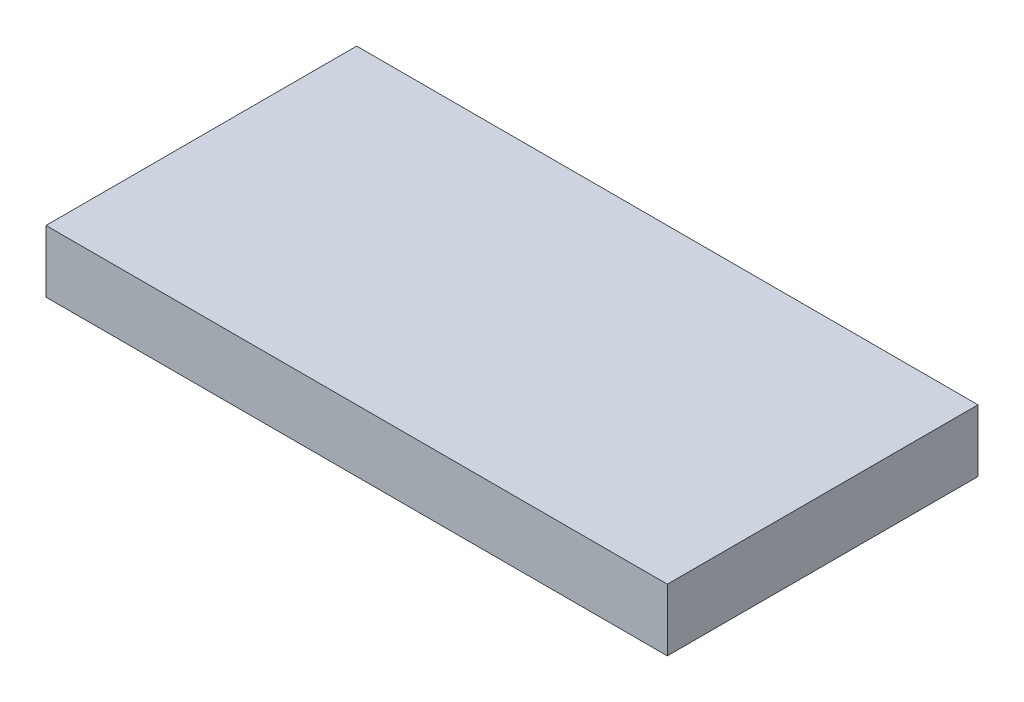
ISO-10303-21;
HEADER;
FILE_DESCRIPTION(('STEP AP214'),'2;1');
FILE_NAME('part.step','',(''),(''),'','','');
FILE_SCHEMA(('AUTOMOTIVE_DESIGN { 1 0 10303 214 1 1 1 1 }'));
ENDSEC;
DATA;
#1=APPLICATION_CONTEXT('core data for automotive mechanical design processes');
#2=APPLICATION_PROTOCOL_DEFINITION('international standard','automotive_design',2000,#1);
#3=PRODUCT_CONTEXT('',#1,'mechanical');
#4=PRODUCT('Part','Part','',(#3));
#5=PRODUCT_RELATED_PRODUCT_CATEGORY('part','',(#4));
#6=PRODUCT_DEFINITION_FORMATION('','',#4);
#7=PRODUCT_DEFINITION_CONTEXT('part definition',#1,'design');
#8=PRODUCT_DEFINITION('design','',#6,#7);
#9=PRODUCT_DEFINITION_SHAPE('','',#8);
#10=(LENGTH_UNIT() NAMED_UNIT(*) SI_UNIT(.MILLI.,.METRE.));
#11=(NAMED_UNIT(*) PLANE_ANGLE_UNIT() SI_UNIT($,.RADIAN.));
#12=(NAMED_UNIT(*) SI_UNIT($,.STERADIAN.) SOLID_ANGLE_UNIT());
#13=UNCERTAINTY_MEASURE_WITH_UNIT(LENGTH_MEASURE(1.E-05),#10,'distance_accuracy_value','');
#14=(GEOMETRIC_REPRESENTATION_CONTEXT(3) GLOBAL_UNCERTAINTY_ASSIGNED_CONTEXT((#13)) GLOBAL_UNIT_ASSIGNED_CONTEXT((#10,
#11,#12)) REPRESENTATION_CONTEXT('',''));
#15=CARTESIAN_POINT('',(0.,0.,0.));
#16=DIRECTION('',(0.,0.,1.));
#17=DIRECTION('',(1.,0.,0.));
#18=AXIS2_PLACEMENT_3D('',#15,#16,#17);
#19=CARTESIAN_POINT('',(0.,1.,0.));
#20=DIRECTION('',(1.,0.,0.));
#21=DIRECTION('',(0.,0.,-1.));
#22=AXIS2_PLACEMENT_3D('',#19,#20,#21);
#23=PLANE('',#22);
#24=DIRECTION('',(0.,0.,1.));
#25=VECTOR('',#24,1.);
#26=CARTESIAN_POINT('',(0.,0.,0.));
#27=LINE('',#26,#25);
#28=CARTESIAN_POINT('',(0.,0.,-5.));
#29=VERTEX_POINT('',#28);
#30=CARTESIAN_POINT('',(0.,0.,0.));
#31=VERTEX_POINT('',#30);
#32=EDGE_CURVE('E100',#29,#31,#27,.T.);
#33=ORIENTED_EDGE('',*,*,#32,.T.);
#34=DIRECTION('',(0.,-1.,0.));
#35=VECTOR('',#34,1.);
#36=CARTESIAN_POINT('',(0.,1.,0.));
#37=LINE('',#36,#35);
#38=CARTESIAN_POINT('',(0.,1.,0.));
#39=VERTEX_POINT('',#38);
#40=EDGE_CURVE('E11',#39,#31,#37,.T.);
#41=ORIENTED_EDGE('',*,*,#40,.F.);
#42=DIRECTION('',(0.,0.,1.));
#43=VECTOR('',#42,1.);
#44=CARTESIAN_POINT('',(0.,1.,0.));
#45=LINE('',#44,#43);
#46=CARTESIAN_POINT('',(0.,1.,-5.));
#47=VERTEX_POINT('',#46);
#48=EDGE_CURVE('E88',#47,#39,#45,.T.);
#49=ORIENTED_EDGE('',*,*,#48,.F.);
#50=DIRECTION('',(0.,-1.,0.));
#51=VECTOR('',#50,1.);
#52=CARTESIAN_POINT('',(0.,1.,-5.));
#53=LINE('',#52,#51);
#54=EDGE_CURVE('E96',#47,#29,#53,.T.);
#55=ORIENTED_EDGE('',*,*,#54,.T.);
#56=EDGE_LOOP('',(#33,#41,#49,#55));
#57=FACE_BOUND('',#56,.T.);
#58=ADVANCED_FACE('F37',(#57),#23,.F.);
#59=CARTESIAN_POINT('',(0.,1.,0.));
#60=DIRECTION('',(0.,0.,-1.));
#61=DIRECTION('',(-1.,0.,0.));
#62=AXIS2_PLACEMENT_3D('',#59,#60,#61);
#63=PLANE('',#62);
#64=DIRECTION('',(1.,0.,0.));
#65=VECTOR('',#64,1.);
#66=CARTESIAN_POINT('',(0.,0.,0.));
#67=LINE('',#66,#65);
#68=CARTESIAN_POINT('',(10.,0.,0.));
#69=VERTEX_POINT('',#68);
#70=EDGE_CURVE('E92',#31,#69,#67,.T.);
#71=ORIENTED_EDGE('',*,*,#70,.T.);
#72=DIRECTION('',(0.,-1.,0.));
#73=VECTOR('',#72,1.);
#74=CARTESIAN_POINT('',(10.,1.,0.));
#75=LINE('',#74,#73);
#76=CARTESIAN_POINT('',(10.,1.,0.));
#77=VERTEX_POINT('',#76);
#78=EDGE_CURVE('E45',#77,#69,#75,.T.);
#79=ORIENTED_EDGE('',*,*,#78,.F.);
#80=DIRECTION('',(1.,0.,0.));
#81=VECTOR('',#80,1.);
#82=CARTESIAN_POINT('',(0.,1.,0.));
#83=LINE('',#82,#81);
#84=EDGE_CURVE('E83',#39,#77,#83,.T.);
#85=ORIENTED_EDGE('',*,*,#84,.F.);
#86=ORIENTED_EDGE('',*,*,#40,.T.);
#87=EDGE_LOOP('',(#71,#79,#85,#86));
#88=FACE_BOUND('',#87,.T.);
#89=ADVANCED_FACE('F91',(#88),#63,.F.);
#90=CARTESIAN_POINT('',(10.,1.,0.));
#91=DIRECTION('',(-1.,0.,0.));
#92=DIRECTION('',(0.,0.,1.));
#93=AXIS2_PLACEMENT_3D('',#90,#91,#92);
#94=PLANE('',#93);
#95=DIRECTION('',(0.,0.,-1.));
#96=VECTOR('',#95,1.);
#97=CARTESIAN_POINT('',(10.,0.,0.));
#98=LINE('',#97,#96);
#99=CARTESIAN_POINT('',(10.,0.,-5.));
#100=VERTEX_POINT('',#99);
#101=EDGE_CURVE('E70',#69,#100,#98,.T.);
#102=ORIENTED_EDGE('',*,*,#101,.T.);
#103=DIRECTION('',(0.,-1.,0.));
#104=VECTOR('',#103,1.);
#105=CARTESIAN_POINT('',(10.,1.,-5.));
#106=LINE('',#105,#104);
#107=CARTESIAN_POINT('',(10.,1.,-5.));
#108=VERTEX_POINT('',#107);
#109=EDGE_CURVE('E93',#108,#100,#106,.T.);
#110=ORIENTED_EDGE('',*,*,#109,.F.);
#111=DIRECTION('',(0.,0.,-1.));
#112=VECTOR('',#111,1.);
#113=CARTESIAN_POINT('',(10.,1.,0.));
#114=LINE('',#113,#112);
#115=EDGE_CURVE('E86',#77,#108,#114,.T.);
#116=ORIENTED_EDGE('',*,*,#115,.F.);
#117=ORIENTED_EDGE('',*,*,#78,.T.);
#118=EDGE_LOOP('',(#102,#110,#116,#117));
#119=FACE_BOUND('',#118,.T.);
#120=ADVANCED_FACE('F94',(#119),#94,.F.);
#121=CARTESIAN_POINT('',(0.,1.,-5.));
#122=DIRECTION('',(0.,0.,1.));
#123=DIRECTION('',(1.,0.,0.));
#124=AXIS2_PLACEMENT_3D('',#121,#122,#123);
#125=PLANE('',#124);
#126=DIRECTION('',(-1.,0.,0.));
#127=VECTOR('',#126,1.);
#128=CARTESIAN_POINT('',(0.,0.,-5.));
#129=LINE('',#128,#127);
#130=EDGE_CURVE('E76',#100,#29,#129,.T.);
#131=ORIENTED_EDGE('',*,*,#130,.T.);
#132=ORIENTED_EDGE('',*,*,#54,.F.);
#133=DIRECTION('',(-1.,0.,0.));
#134=VECTOR('',#133,1.);
#135=CARTESIAN_POINT('',(0.,1.,-5.));
#136=LINE('',#135,#134);
#137=EDGE_CURVE('E53',#108,#47,#136,.T.);
#138=ORIENTED_EDGE('',*,*,#137,.F.);
#139=ORIENTED_EDGE('',*,*,#109,.T.);
#140=EDGE_LOOP('',(#131,#132,#138,#139));
#141=FACE_BOUND('',#140,.T.);
#142=ADVANCED_FACE('F107',(#141),#125,.F.);
#143=CARTESIAN_POINT('',(0.,1.,0.));
#144=DIRECTION('',(0.,-1.,0.));
#145=DIRECTION('',(0.,0.,-1.));
#146=AXIS2_PLACEMENT_3D('',#143,#144,#145);
#147=PLANE('',#146);
#148=ORIENTED_EDGE('',*,*,#48,.T.);
#149=ORIENTED_EDGE('',*,*,#84,.T.);
#150=ORIENTED_EDGE('',*,*,#115,.T.);
#151=ORIENTED_EDGE('',*,*,#137,.T.);
#152=EDGE_LOOP('',(#148,#149,#150,#151));
#153=FACE_BOUND('',#152,.T.);
#154=ADVANCED_FACE('F84',(#153),#147,.F.);
#155=CARTESIAN_POINT('',(0.,0.,0.));
#156=DIRECTION('',(0.,-1.,0.));
#157=DIRECTION('',(0.,0.,-1.));
#158=AXIS2_PLACEMENT_3D('',#155,#156,#157);
#159=PLANE('',#158);
#160=ORIENTED_EDGE('',*,*,#32,.F.);
#161=ORIENTED_EDGE('',*,*,#130,.F.);
#162=ORIENTED_EDGE('',*,*,#101,.F.);
#163=ORIENTED_EDGE('',*,*,#70,.F.);
#164=EDGE_LOOP('',(#160,#161,#162,#163));
#165=FACE_BOUND('',#164,.T.);
#166=ADVANCED_FACE('F110',(#165),#159,.T.);
#167=CLOSED_SHELL('',(#58,#89,#120,#142,#154,#166));
#168=MANIFOLD_SOLID_BREP('B2',#167);
#169=ADVANCED_BREP_SHAPE_REPRESENTATION('',(#18,#168),#14);
#170=SHAPE_DEFINITION_REPRESENTATION(#9,#169);
ENDSEC;
END-ISO-10303-21;
